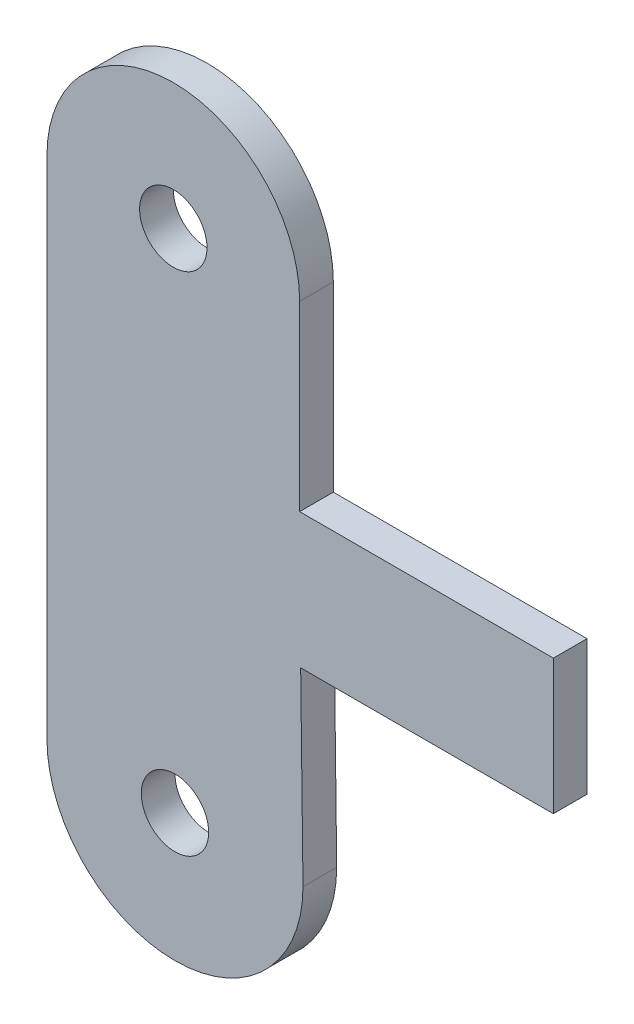
ISO-10303-21;
HEADER;
FILE_DESCRIPTION(('STEP AP214'),'2;1');
FILE_NAME('part.step','',(''),(''),'','','');
FILE_SCHEMA(('AUTOMOTIVE_DESIGN { 1 0 10303 214 1 1 1 1 }'));
ENDSEC;
DATA;
#1=APPLICATION_CONTEXT('core data for automotive mechanical design processes');
#2=APPLICATION_PROTOCOL_DEFINITION('international standard','automotive_design',2000,#1);
#3=PRODUCT_CONTEXT('',#1,'mechanical');
#4=PRODUCT('Part','Part','',(#3));
#5=PRODUCT_RELATED_PRODUCT_CATEGORY('part','',(#4));
#6=PRODUCT_DEFINITION_FORMATION('','',#4);
#7=PRODUCT_DEFINITION_CONTEXT('part definition',#1,'design');
#8=PRODUCT_DEFINITION('design','',#6,#7);
#9=PRODUCT_DEFINITION_SHAPE('','',#8);
#10=(LENGTH_UNIT() NAMED_UNIT(*) SI_UNIT(.MILLI.,.METRE.));
#11=(NAMED_UNIT(*) PLANE_ANGLE_UNIT() SI_UNIT($,.RADIAN.));
#12=(NAMED_UNIT(*) SI_UNIT($,.STERADIAN.) SOLID_ANGLE_UNIT());
#13=UNCERTAINTY_MEASURE_WITH_UNIT(LENGTH_MEASURE(1.E-05),#10,'distance_accuracy_value','');
#14=(GEOMETRIC_REPRESENTATION_CONTEXT(3) GLOBAL_UNCERTAINTY_ASSIGNED_CONTEXT((#13)) GLOBAL_UNIT_ASSIGNED_CONTEXT((#10,
#11,#12)) REPRESENTATION_CONTEXT('',''));
#15=CARTESIAN_POINT('',(0.,0.,0.));
#16=DIRECTION('',(0.,0.,1.));
#17=DIRECTION('',(1.,0.,0.));
#18=AXIS2_PLACEMENT_3D('',#15,#16,#17);
#19=CARTESIAN_POINT('',(-4.97294576091049,0.,2.));
#20=DIRECTION('',(1.,0.,0.));
#21=DIRECTION('',(0.,1.,0.));
#22=AXIS2_PLACEMENT_3D('',#19,#20,#21);
#23=PLANE('',#22);
#24=DIRECTION('',(0.,-1.,0.));
#25=VECTOR('',#24,1.);
#26=CARTESIAN_POINT('',(-4.97294576091049,0.,0.));
#27=LINE('',#26,#25);
#28=CARTESIAN_POINT('',(-4.9729457609105,23.2867843997178,0.));
#29=VERTEX_POINT('',#28);
#30=CARTESIAN_POINT('',(-4.97294576091049,-6.71321560028224,0.));
#31=VERTEX_POINT('',#30);
#32=EDGE_CURVE('E133',#29,#31,#27,.T.);
#33=ORIENTED_EDGE('',*,*,#32,.T.);
#34=DIRECTION('',(0.,0.,-1.));
#35=VECTOR('',#34,1.);
#36=CARTESIAN_POINT('',(-4.97294576091049,-6.71321560028224,2.));
#37=LINE('',#36,#35);
#38=CARTESIAN_POINT('',(-4.97294576091049,-6.71321560028224,2.));
#39=VERTEX_POINT('',#38);
#40=EDGE_CURVE('E11',#39,#31,#37,.T.);
#41=ORIENTED_EDGE('',*,*,#40,.F.);
#42=DIRECTION('',(0.,-1.,0.));
#43=VECTOR('',#42,1.);
#44=CARTESIAN_POINT('',(-4.97294576091049,0.,2.));
#45=LINE('',#44,#43);
#46=CARTESIAN_POINT('',(-4.9729457609105,23.2867843997178,2.));
#47=VERTEX_POINT('',#46);
#48=EDGE_CURVE('E179',#47,#39,#45,.T.);
#49=ORIENTED_EDGE('',*,*,#48,.F.);
#50=DIRECTION('',(0.,0.,-1.));
#51=VECTOR('',#50,1.);
#52=CARTESIAN_POINT('',(-4.9729457609105,23.2867843997178,2.));
#53=LINE('',#52,#51);
#54=EDGE_CURVE('E123',#47,#29,#53,.T.);
#55=ORIENTED_EDGE('',*,*,#54,.T.);
#56=EDGE_LOOP('',(#33,#41,#49,#55));
#57=FACE_BOUND('',#56,.T.);
#58=ADVANCED_FACE('F32',(#57),#23,.F.);
#59=CARTESIAN_POINT('',(2.62705423908951,-6.71321560028224,2.));
#60=DIRECTION('',(0.,0.,-1.));
#61=DIRECTION('',(-1.,0.,0.));
#62=AXIS2_PLACEMENT_3D('',#59,#60,#61);
#63=CYLINDRICAL_SURFACE('',#62,7.6);
#64=CARTESIAN_POINT('',(2.62705423908951,-6.71321560028224,0.));
#65=DIRECTION('',(0.,0.,1.));
#66=DIRECTION('',(1.,0.,0.));
#67=AXIS2_PLACEMENT_3D('',#64,#65,#66);
#68=CIRCLE('',#67,7.6);
#69=CARTESIAN_POINT('',(10.2270542390895,-6.71321560028224,0.));
#70=VERTEX_POINT('',#69);
#71=EDGE_CURVE('E136',#31,#70,#68,.T.);
#72=ORIENTED_EDGE('',*,*,#71,.T.);
#73=DIRECTION('',(0.,0.,-1.));
#74=VECTOR('',#73,1.);
#75=CARTESIAN_POINT('',(10.2270542390895,-6.71321560028224,2.));
#76=LINE('',#75,#74);
#77=CARTESIAN_POINT('',(10.2270542390895,-6.71321560028224,2.));
#78=VERTEX_POINT('',#77);
#79=EDGE_CURVE('E41',#78,#70,#76,.T.);
#80=ORIENTED_EDGE('',*,*,#79,.F.);
#81=CARTESIAN_POINT('',(2.62705423908951,-6.71321560028224,2.));
#82=DIRECTION('',(0.,0.,1.));
#83=DIRECTION('',(1.,0.,0.));
#84=AXIS2_PLACEMENT_3D('',#81,#82,#83);
#85=CIRCLE('',#84,7.6);
#86=EDGE_CURVE('E88',#39,#78,#85,.T.);
#87=ORIENTED_EDGE('',*,*,#86,.F.);
#88=ORIENTED_EDGE('',*,*,#40,.T.);
#89=EDGE_LOOP('',(#72,#80,#87,#88));
#90=FACE_BOUND('',#89,.T.);
#91=ADVANCED_FACE('F165',(#90),#63,.T.);
#92=CARTESIAN_POINT('',(10.1423318342454,0.12564702506808,2.));
#93=DIRECTION('',(0.999923272895669,0.0123874259478936,0.));
#94=DIRECTION('',(-0.0123874259478936,0.999923272895669,0.));
#95=AXIS2_PLACEMENT_3D('',#92,#93,#94);
#96=PLANE('',#95);
#97=DIRECTION('',(0.0123874259478936,-0.999923272895669,0.));
#98=VECTOR('',#97,1.);
#99=CARTESIAN_POINT('',(10.1423318342454,0.12564702506808,0.));
#100=LINE('',#99,#98);
#101=CARTESIAN_POINT('',(10.0884496834074,4.47505882726565,0.));
#102=VERTEX_POINT('',#101);
#103=EDGE_CURVE('E139',#102,#70,#100,.T.);
#104=ORIENTED_EDGE('',*,*,#103,.F.);
#105=DIRECTION('',(0.,0.,-1.));
#106=VECTOR('',#105,1.);
#107=CARTESIAN_POINT('',(10.0884496834074,4.47505882726565,2.));
#108=LINE('',#107,#106);
#109=CARTESIAN_POINT('',(10.0884496834074,4.47505882726565,2.));
#110=VERTEX_POINT('',#109);
#111=EDGE_CURVE('E158',#110,#102,#108,.T.);
#112=ORIENTED_EDGE('',*,*,#111,.F.);
#113=DIRECTION('',(0.0123874259478936,-0.999923272895669,0.));
#114=VECTOR('',#113,1.);
#115=CARTESIAN_POINT('',(10.1423318342454,0.12564702506808,2.));
#116=LINE('',#115,#114);
#117=EDGE_CURVE('E164',#110,#78,#116,.T.);
#118=ORIENTED_EDGE('',*,*,#117,.T.);
#119=ORIENTED_EDGE('',*,*,#79,.T.);
#120=EDGE_LOOP('',(#104,#112,#118,#119));
#121=FACE_BOUND('',#120,.T.);
#122=ADVANCED_FACE('F162',(#121),#96,.T.);
#123=CARTESIAN_POINT('',(0.,4.47505882726565,2.));
#124=DIRECTION('',(0.,1.,0.));
#125=DIRECTION('',(0.,0.,1.));
#126=AXIS2_PLACEMENT_3D('',#123,#124,#125);
#127=PLANE('',#126);
#128=DIRECTION('',(1.,0.,0.));
#129=VECTOR('',#128,1.);
#130=CARTESIAN_POINT('',(0.,4.47505882726565,0.));
#131=LINE('',#130,#129);
#132=CARTESIAN_POINT('',(25.0884496834074,4.47505882726565,0.));
#133=VERTEX_POINT('',#132);
#134=EDGE_CURVE('E142',#102,#133,#131,.T.);
#135=ORIENTED_EDGE('',*,*,#134,.T.);
#136=DIRECTION('',(0.,0.,-1.));
#137=VECTOR('',#136,1.);
#138=CARTESIAN_POINT('',(25.0884496834074,4.47505882726565,2.));
#139=LINE('',#138,#137);
#140=CARTESIAN_POINT('',(25.0884496834074,4.47505882726565,2.));
#141=VERTEX_POINT('',#140);
#142=EDGE_CURVE('E156',#141,#133,#139,.T.);
#143=ORIENTED_EDGE('',*,*,#142,.F.);
#144=DIRECTION('',(1.,0.,0.));
#145=VECTOR('',#144,1.);
#146=CARTESIAN_POINT('',(0.,4.47505882726565,2.));
#147=LINE('',#146,#145);
#148=EDGE_CURVE('E176',#110,#141,#147,.T.);
#149=ORIENTED_EDGE('',*,*,#148,.F.);
#150=ORIENTED_EDGE('',*,*,#111,.T.);
#151=EDGE_LOOP('',(#135,#143,#149,#150));
#152=FACE_BOUND('',#151,.T.);
#153=ADVANCED_FACE('F174',(#152),#127,.F.);
#154=CARTESIAN_POINT('',(25.0884496834074,0.,2.));
#155=DIRECTION('',(1.,0.,0.));
#156=DIRECTION('',(0.,1.,0.));
#157=AXIS2_PLACEMENT_3D('',#154,#155,#156);
#158=PLANE('',#157);
#159=DIRECTION('',(0.,-1.,0.));
#160=VECTOR('',#159,1.);
#161=CARTESIAN_POINT('',(25.0884496834074,0.,0.));
#162=LINE('',#161,#160);
#163=CARTESIAN_POINT('',(25.0884496834073,12.4750588272657,0.));
#164=VERTEX_POINT('',#163);
#165=EDGE_CURVE('E145',#164,#133,#162,.T.);
#166=ORIENTED_EDGE('',*,*,#165,.F.);
#167=DIRECTION('',(0.,0.,-1.));
#168=VECTOR('',#167,1.);
#169=CARTESIAN_POINT('',(25.0884496834073,12.4750588272657,2.));
#170=LINE('',#169,#168);
#171=CARTESIAN_POINT('',(25.0884496834073,12.4750588272657,2.));
#172=VERTEX_POINT('',#171);
#173=EDGE_CURVE('E113',#172,#164,#170,.T.);
#174=ORIENTED_EDGE('',*,*,#173,.F.);
#175=DIRECTION('',(0.,-1.,0.));
#176=VECTOR('',#175,1.);
#177=CARTESIAN_POINT('',(25.0884496834074,0.,2.));
#178=LINE('',#177,#176);
#179=EDGE_CURVE('E119',#172,#141,#178,.T.);
#180=ORIENTED_EDGE('',*,*,#179,.T.);
#181=ORIENTED_EDGE('',*,*,#142,.T.);
#182=EDGE_LOOP('',(#166,#174,#180,#181));
#183=FACE_BOUND('',#182,.T.);
#184=ADVANCED_FACE('F183',(#183),#158,.T.);
#185=CARTESIAN_POINT('',(0.,12.4750588272657,2.));
#186=DIRECTION('',(0.,1.,0.));
#187=DIRECTION('',(-1.,0.,0.));
#188=AXIS2_PLACEMENT_3D('',#185,#186,#187);
#189=PLANE('',#188);
#190=DIRECTION('',(1.,0.,0.));
#191=VECTOR('',#190,1.);
#192=CARTESIAN_POINT('',(0.,12.4750588272657,0.));
#193=LINE('',#192,#191);
#194=CARTESIAN_POINT('',(10.0270542390895,12.4750588272657,0.));
#195=VERTEX_POINT('',#194);
#196=EDGE_CURVE('E108',#195,#164,#193,.T.);
#197=ORIENTED_EDGE('',*,*,#196,.F.);
#198=DIRECTION('',(0.,0.,-1.));
#199=VECTOR('',#198,1.);
#200=CARTESIAN_POINT('',(10.0270542390895,12.4750588272657,2.));
#201=LINE('',#200,#199);
#202=CARTESIAN_POINT('',(10.0270542390895,12.4750588272657,2.));
#203=VERTEX_POINT('',#202);
#204=EDGE_CURVE('E103',#203,#195,#201,.T.);
#205=ORIENTED_EDGE('',*,*,#204,.F.);
#206=DIRECTION('',(1.,0.,0.));
#207=VECTOR('',#206,1.);
#208=CARTESIAN_POINT('',(0.,12.4750588272657,2.));
#209=LINE('',#208,#207);
#210=EDGE_CURVE('E106',#203,#172,#209,.T.);
#211=ORIENTED_EDGE('',*,*,#210,.T.);
#212=ORIENTED_EDGE('',*,*,#173,.T.);
#213=EDGE_LOOP('',(#197,#205,#211,#212));
#214=FACE_BOUND('',#213,.T.);
#215=ADVANCED_FACE('F105',(#214),#189,.T.);
#216=CARTESIAN_POINT('',(10.0270542390895,0.,2.));
#217=DIRECTION('',(1.,0.,0.));
#218=DIRECTION('',(0.,1.,0.));
#219=AXIS2_PLACEMENT_3D('',#216,#217,#218);
#220=PLANE('',#219);
#221=DIRECTION('',(0.,-1.,0.));
#222=VECTOR('',#221,1.);
#223=CARTESIAN_POINT('',(10.0270542390895,0.,0.));
#224=LINE('',#223,#222);
#225=CARTESIAN_POINT('',(10.0270542390895,23.2867843997177,0.));
#226=VERTEX_POINT('',#225);
#227=EDGE_CURVE('E149',#226,#195,#224,.T.);
#228=ORIENTED_EDGE('',*,*,#227,.F.);
#229=DIRECTION('',(0.,0.,-1.));
#230=VECTOR('',#229,1.);
#231=CARTESIAN_POINT('',(10.0270542390895,23.2867843997177,2.));
#232=LINE('',#231,#230);
#233=CARTESIAN_POINT('',(10.0270542390895,23.2867843997177,2.));
#234=VERTEX_POINT('',#233);
#235=EDGE_CURVE('E77',#234,#226,#232,.T.);
#236=ORIENTED_EDGE('',*,*,#235,.F.);
#237=DIRECTION('',(0.,-1.,0.));
#238=VECTOR('',#237,1.);
#239=CARTESIAN_POINT('',(10.0270542390895,0.,2.));
#240=LINE('',#239,#238);
#241=EDGE_CURVE('E117',#234,#203,#240,.T.);
#242=ORIENTED_EDGE('',*,*,#241,.T.);
#243=ORIENTED_EDGE('',*,*,#204,.T.);
#244=EDGE_LOOP('',(#228,#236,#242,#243));
#245=FACE_BOUND('',#244,.T.);
#246=ADVANCED_FACE('F121',(#245),#220,.T.);
#247=CARTESIAN_POINT('',(2.62705423908951,-6.71321560028224,2.));
#248=DIRECTION('',(0.,0.,-1.));
#249=DIRECTION('',(-1.,0.,0.));
#250=AXIS2_PLACEMENT_3D('',#247,#248,#249);
#251=CYLINDRICAL_SURFACE('',#250,2.);
#252=CARTESIAN_POINT('',(2.62705423908951,-6.71321560028224,2.));
#253=DIRECTION('',(0.,0.,1.));
#254=DIRECTION('',(1.,0.,0.));
#255=AXIS2_PLACEMENT_3D('',#252,#253,#254);
#256=CIRCLE('',#255,2.);
#257=CARTESIAN_POINT('',(4.62705423908951,-6.71321560028224,2.));
#258=VERTEX_POINT('',#257);
#259=EDGE_CURVE('E214',#258,#258,#256,.T.);
#260=ORIENTED_EDGE('',*,*,#259,.T.);
#261=EDGE_LOOP('',(#260));
#262=FACE_BOUND('',#261,.T.);
#263=CARTESIAN_POINT('',(2.62705423908951,-6.71321560028224,0.));
#264=DIRECTION('',(0.,0.,1.));
#265=DIRECTION('',(1.,0.,0.));
#266=AXIS2_PLACEMENT_3D('',#263,#264,#265);
#267=CIRCLE('',#266,2.);
#268=CARTESIAN_POINT('',(4.62705423908951,-6.71321560028224,0.));
#269=VERTEX_POINT('',#268);
#270=EDGE_CURVE('E130',#269,#269,#267,.T.);
#271=ORIENTED_EDGE('',*,*,#270,.F.);
#272=EDGE_LOOP('',(#271));
#273=FACE_BOUND('',#272,.T.);
#274=ADVANCED_FACE('F195',(#262,#273),#251,.F.);
#275=CARTESIAN_POINT('',(2.5270542390895,23.2867843997177,2.));
#276=DIRECTION('',(0.,0.,-1.));
#277=DIRECTION('',(-1.,0.,0.));
#278=AXIS2_PLACEMENT_3D('',#275,#276,#277);
#279=CYLINDRICAL_SURFACE('',#278,2.);
#280=CARTESIAN_POINT('',(2.5270542390895,23.2867843997177,2.));
#281=DIRECTION('',(0.,0.,1.));
#282=DIRECTION('',(1.,0.,0.));
#283=AXIS2_PLACEMENT_3D('',#280,#281,#282);
#284=CIRCLE('',#283,2.);
#285=CARTESIAN_POINT('',(4.5270542390895,23.2867843997177,2.));
#286=VERTEX_POINT('',#285);
#287=EDGE_CURVE('E152',#286,#286,#284,.T.);
#288=ORIENTED_EDGE('',*,*,#287,.T.);
#289=EDGE_LOOP('',(#288));
#290=FACE_BOUND('',#289,.T.);
#291=CARTESIAN_POINT('',(2.5270542390895,23.2867843997177,0.));
#292=DIRECTION('',(0.,0.,1.));
#293=DIRECTION('',(1.,0.,0.));
#294=AXIS2_PLACEMENT_3D('',#291,#292,#293);
#295=CIRCLE('',#294,2.);
#296=CARTESIAN_POINT('',(4.5270542390895,23.2867843997177,0.));
#297=VERTEX_POINT('',#296);
#298=EDGE_CURVE('E127',#297,#297,#295,.T.);
#299=ORIENTED_EDGE('',*,*,#298,.F.);
#300=EDGE_LOOP('',(#299));
#301=FACE_BOUND('',#300,.T.);
#302=ADVANCED_FACE('F34',(#290,#301),#279,.F.);
#303=CARTESIAN_POINT('',(2.5270542390895,23.2867843997177,2.));
#304=DIRECTION('',(0.,0.,-1.));
#305=DIRECTION('',(-1.,0.,0.));
#306=AXIS2_PLACEMENT_3D('',#303,#304,#305);
#307=CYLINDRICAL_SURFACE('',#306,7.5);
#308=CARTESIAN_POINT('',(2.5270542390895,23.2867843997177,0.));
#309=DIRECTION('',(0.,0.,1.));
#310=DIRECTION('',(1.,0.,0.));
#311=AXIS2_PLACEMENT_3D('',#308,#309,#310);
#312=CIRCLE('',#311,7.5);
#313=EDGE_CURVE('E80',#226,#29,#312,.T.);
#314=ORIENTED_EDGE('',*,*,#313,.T.);
#315=ORIENTED_EDGE('',*,*,#54,.F.);
#316=CARTESIAN_POINT('',(2.5270542390895,23.2867843997177,2.));
#317=DIRECTION('',(0.,0.,1.));
#318=DIRECTION('',(1.,0.,0.));
#319=AXIS2_PLACEMENT_3D('',#316,#317,#318);
#320=CIRCLE('',#319,7.5);
#321=EDGE_CURVE('E49',#234,#47,#320,.T.);
#322=ORIENTED_EDGE('',*,*,#321,.F.);
#323=ORIENTED_EDGE('',*,*,#235,.T.);
#324=EDGE_LOOP('',(#314,#315,#322,#323));
#325=FACE_BOUND('',#324,.T.);
#326=ADVANCED_FACE('F186',(#325),#307,.T.);
#327=CARTESIAN_POINT('',(0.,0.,2.));
#328=DIRECTION('',(0.,0.,1.));
#329=DIRECTION('',(1.,0.,0.));
#330=AXIS2_PLACEMENT_3D('',#327,#328,#329);
#331=PLANE('',#330);
#332=ORIENTED_EDGE('',*,*,#287,.F.);
#333=EDGE_LOOP('',(#332));
#334=FACE_BOUND('',#333,.T.);
#335=ORIENTED_EDGE('',*,*,#259,.F.);
#336=EDGE_LOOP('',(#335));
#337=FACE_BOUND('',#336,.T.);
#338=ORIENTED_EDGE('',*,*,#48,.T.);
#339=ORIENTED_EDGE('',*,*,#86,.T.);
#340=ORIENTED_EDGE('',*,*,#117,.F.);
#341=ORIENTED_EDGE('',*,*,#148,.T.);
#342=ORIENTED_EDGE('',*,*,#179,.F.);
#343=ORIENTED_EDGE('',*,*,#210,.F.);
#344=ORIENTED_EDGE('',*,*,#241,.F.);
#345=ORIENTED_EDGE('',*,*,#321,.T.);
#346=EDGE_LOOP('',(#338,#339,#340,#341,#342,#343,#344,#345));
#347=FACE_BOUND('',#346,.T.);
#348=ADVANCED_FACE('F116',(#334,#337,#347),#331,.T.);
#349=CARTESIAN_POINT('',(0.,0.,0.));
#350=DIRECTION('',(0.,0.,1.));
#351=DIRECTION('',(1.,0.,0.));
#352=AXIS2_PLACEMENT_3D('',#349,#350,#351);
#353=PLANE('',#352);
#354=ORIENTED_EDGE('',*,*,#298,.T.);
#355=EDGE_LOOP('',(#354));
#356=FACE_BOUND('',#355,.T.);
#357=ORIENTED_EDGE('',*,*,#270,.T.);
#358=EDGE_LOOP('',(#357));
#359=FACE_BOUND('',#358,.T.);
#360=ORIENTED_EDGE('',*,*,#32,.F.);
#361=ORIENTED_EDGE('',*,*,#313,.F.);
#362=ORIENTED_EDGE('',*,*,#227,.T.);
#363=ORIENTED_EDGE('',*,*,#196,.T.);
#364=ORIENTED_EDGE('',*,*,#165,.T.);
#365=ORIENTED_EDGE('',*,*,#134,.F.);
#366=ORIENTED_EDGE('',*,*,#103,.T.);
#367=ORIENTED_EDGE('',*,*,#71,.F.);
#368=EDGE_LOOP('',(#360,#361,#362,#363,#364,#365,#366,#367));
#369=FACE_BOUND('',#368,.T.);
#370=ADVANCED_FACE('F170',(#356,#359,#369),#353,.F.);
#371=CLOSED_SHELL('',(#58,#91,#122,#153,#184,#215,#246,#274,#302,#326,#348,#370));
#372=MANIFOLD_SOLID_BREP('B2',#371);
#373=ADVANCED_BREP_SHAPE_REPRESENTATION('',(#18,#372),#14);
#374=SHAPE_DEFINITION_REPRESENTATION(#9,#373);
ENDSEC;
END-ISO-10303-21;
